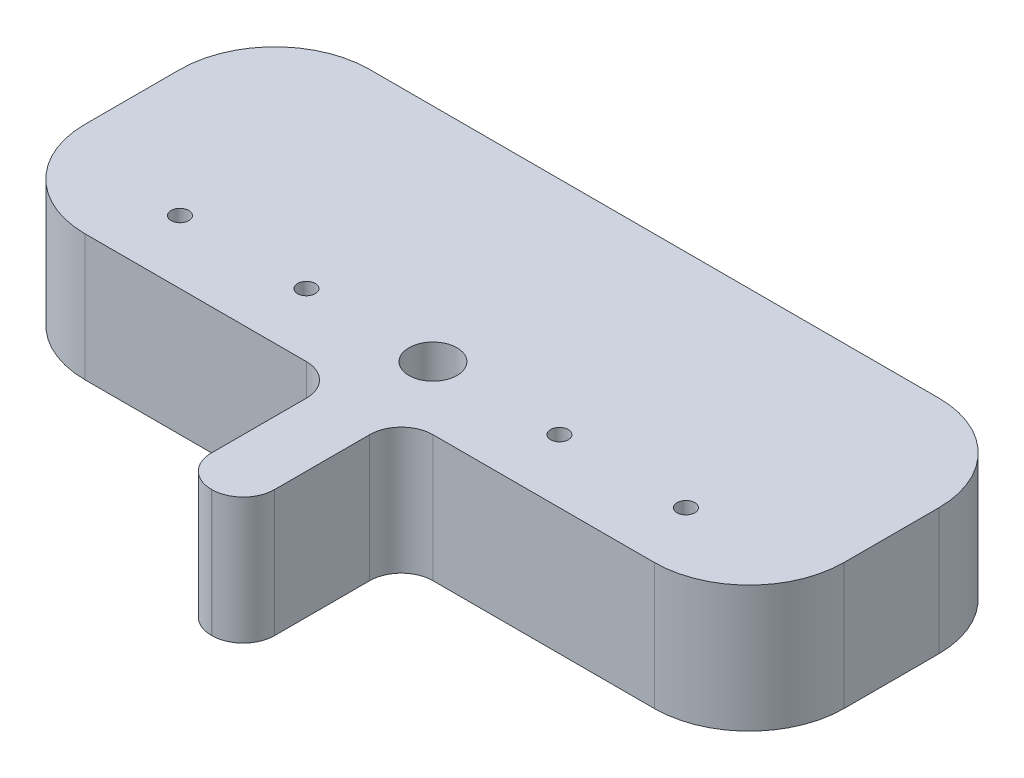
ISO-10303-21;
HEADER;
FILE_DESCRIPTION(('STEP AP214'),'2;1');
FILE_NAME('part.step','',(''),(''),'','','');
FILE_SCHEMA(('AUTOMOTIVE_DESIGN { 1 0 10303 214 1 1 1 1 }'));
ENDSEC;
DATA;
#1=APPLICATION_CONTEXT('core data for automotive mechanical design processes');
#2=APPLICATION_PROTOCOL_DEFINITION('international standard','automotive_design',2000,#1);
#3=PRODUCT_CONTEXT('',#1,'mechanical');
#4=PRODUCT('Part','Part','',(#3));
#5=PRODUCT_RELATED_PRODUCT_CATEGORY('part','',(#4));
#6=PRODUCT_DEFINITION_FORMATION('','',#4);
#7=PRODUCT_DEFINITION_CONTEXT('part definition',#1,'design');
#8=PRODUCT_DEFINITION('design','',#6,#7);
#9=PRODUCT_DEFINITION_SHAPE('','',#8);
#10=(LENGTH_UNIT() NAMED_UNIT(*) SI_UNIT(.MILLI.,.METRE.));
#11=(NAMED_UNIT(*) PLANE_ANGLE_UNIT() SI_UNIT($,.RADIAN.));
#12=(NAMED_UNIT(*) SI_UNIT($,.STERADIAN.) SOLID_ANGLE_UNIT());
#13=UNCERTAINTY_MEASURE_WITH_UNIT(LENGTH_MEASURE(1.E-05),#10,'distance_accuracy_value','');
#14=(GEOMETRIC_REPRESENTATION_CONTEXT(3) GLOBAL_UNCERTAINTY_ASSIGNED_CONTEXT((#13)) GLOBAL_UNIT_ASSIGNED_CONTEXT((#10,
#11,#12)) REPRESENTATION_CONTEXT('',''));
#15=CARTESIAN_POINT('',(0.,0.,0.));
#16=DIRECTION('',(0.,0.,1.));
#17=DIRECTION('',(1.,0.,0.));
#18=AXIS2_PLACEMENT_3D('',#15,#16,#17);
#19=CARTESIAN_POINT('',(16.2968222222222,12.7,8.62817777777777));
#20=DIRECTION('',(0.,1.,0.));
#21=DIRECTION('',(0.,0.,1.));
#22=AXIS2_PLACEMENT_3D('',#19,#20,#21);
#23=PLANE('',#22);
#24=CARTESIAN_POINT('',(-9.0777777777778,12.7,-10.4472222222221));
#25=DIRECTION('',(0.,1.,0.));
#26=DIRECTION('',(0.,0.,1.));
#27=AXIS2_PLACEMENT_3D('',#24,#25,#26);
#28=CIRCLE('',#27,0.889000000000002);
#29=CARTESIAN_POINT('',(-9.0777777777778,12.7,-9.55822222222205));
#30=VERTEX_POINT('',#29);
#31=EDGE_CURVE('E347',#30,#30,#28,.T.);
#32=ORIENTED_EDGE('',*,*,#31,.F.);
#33=EDGE_LOOP('',(#32));
#34=FACE_BOUND('',#33,.T.);
#35=CARTESIAN_POINT('',(29.0222222222222,12.7,-10.4472222222222));
#36=DIRECTION('',(0.,1.,0.));
#37=DIRECTION('',(0.,0.,1.));
#38=AXIS2_PLACEMENT_3D('',#35,#36,#37);
#39=CIRCLE('',#38,0.889);
#40=CARTESIAN_POINT('',(29.0222222222222,12.7,-9.55822222222223));
#41=VERTEX_POINT('',#40);
#42=EDGE_CURVE('E359',#41,#41,#39,.T.);
#43=ORIENTED_EDGE('',*,*,#42,.F.);
#44=EDGE_LOOP('',(#43));
#45=FACE_BOUND('',#44,.T.);
#46=CARTESIAN_POINT('',(16.2968222222222,12.7,8.62817777777777));
#47=DIRECTION('',(0.,1.,0.));
#48=DIRECTION('',(0.,0.,1.));
#49=AXIS2_PLACEMENT_3D('',#46,#47,#48);
#50=CIRCLE('',#49,3.1496);
#51=CARTESIAN_POINT('',(13.1472222222222,12.7,8.62817777777775));
#52=VERTEX_POINT('',#51);
#53=CARTESIAN_POINT('',(16.2968222222222,12.7,11.7777777777778));
#54=VERTEX_POINT('',#53);
#55=EDGE_CURVE('E208',#52,#54,#50,.T.);
#56=ORIENTED_EDGE('',*,*,#55,.T.);
#57=DIRECTION('',(1.,0.,0.));
#58=VECTOR('',#57,1.);
#59=CARTESIAN_POINT('',(16.2968222222222,12.7,11.7777777777778));
#60=LINE('',#59,#58);
#61=CARTESIAN_POINT('',(16.3476222222222,12.7,11.7777777777778));
#62=VERTEX_POINT('',#61);
#63=EDGE_CURVE('E116',#54,#62,#60,.T.);
#64=ORIENTED_EDGE('',*,*,#63,.T.);
#65=CARTESIAN_POINT('',(16.3476222222222,12.7,8.62817777777777));
#66=DIRECTION('',(0.,1.,0.));
#67=DIRECTION('',(0.,0.,1.));
#68=AXIS2_PLACEMENT_3D('',#65,#66,#67);
#69=CIRCLE('',#68,3.1496);
#70=CARTESIAN_POINT('',(19.4972222222222,12.7,8.62817777777775));
#71=VERTEX_POINT('',#70);
#72=EDGE_CURVE('E247',#62,#71,#69,.T.);
#73=ORIENTED_EDGE('',*,*,#72,.T.);
#74=DIRECTION('',(0.,0.,-1.));
#75=VECTOR('',#74,1.);
#76=CARTESIAN_POINT('',(19.4972222222222,12.7,-0.922222222222205));
#77=LINE('',#76,#75);
#78=CARTESIAN_POINT('',(19.4972222222222,12.7,-0.922222222222205));
#79=VERTEX_POINT('',#78);
#80=EDGE_CURVE('E266',#71,#79,#77,.T.);
#81=ORIENTED_EDGE('',*,*,#80,.T.);
#82=CARTESIAN_POINT('',(22.6722222222222,12.7,-0.922222222222228));
#83=DIRECTION('',(0.,-1.,0.));
#84=DIRECTION('',(0.,0.,-1.));
#85=AXIS2_PLACEMENT_3D('',#82,#83,#84);
#86=CIRCLE('',#85,3.175);
#87=CARTESIAN_POINT('',(22.6722222222222,12.7,-4.09722222222223));
#88=VERTEX_POINT('',#87);
#89=EDGE_CURVE('E263',#79,#88,#86,.T.);
#90=ORIENTED_EDGE('',*,*,#89,.T.);
#91=DIRECTION('',(1.,0.,0.));
#92=VECTOR('',#91,1.);
#93=CARTESIAN_POINT('',(22.6722222222222,12.7,-4.09722222222223));
#94=LINE('',#93,#92);
#95=CARTESIAN_POINT('',(44.8972222222221,12.7,-4.09722222222223));
#96=VERTEX_POINT('',#95);
#97=EDGE_CURVE('E265',#88,#96,#94,.T.);
#98=ORIENTED_EDGE('',*,*,#97,.T.);
#99=CARTESIAN_POINT('',(44.8972222222222,12.7,-13.6222222222222));
#100=DIRECTION('',(0.,1.,0.));
#101=DIRECTION('',(0.,0.,1.));
#102=AXIS2_PLACEMENT_3D('',#99,#100,#101);
#103=CIRCLE('',#102,9.525);
#104=CARTESIAN_POINT('',(54.4222222222222,12.7,-13.6222222222223));
#105=VERTEX_POINT('',#104);
#106=EDGE_CURVE('E268',#96,#105,#103,.T.);
#107=ORIENTED_EDGE('',*,*,#106,.T.);
#108=DIRECTION('',(0.,0.,-1.));
#109=VECTOR('',#108,1.);
#110=CARTESIAN_POINT('',(54.4222222222222,12.7,-23.1472222222222));
#111=LINE('',#110,#109);
#112=CARTESIAN_POINT('',(54.4222222222222,12.7,-23.1472222222222));
#113=VERTEX_POINT('',#112);
#114=EDGE_CURVE('E274',#105,#113,#111,.T.);
#115=ORIENTED_EDGE('',*,*,#114,.T.);
#116=CARTESIAN_POINT('',(44.8972222222222,12.7,-23.1472222222222));
#117=DIRECTION('',(0.,1.,0.));
#118=DIRECTION('',(0.,0.,-1.));
#119=AXIS2_PLACEMENT_3D('',#116,#117,#118);
#120=CIRCLE('',#119,9.525);
#121=CARTESIAN_POINT('',(44.8972222222221,12.7,-32.6722222222222));
#122=VERTEX_POINT('',#121);
#123=EDGE_CURVE('E276',#113,#122,#120,.T.);
#124=ORIENTED_EDGE('',*,*,#123,.T.);
#125=DIRECTION('',(-1.,0.,0.));
#126=VECTOR('',#125,1.);
#127=CARTESIAN_POINT('',(-12.2527777777777,12.7,-32.6722222222222));
#128=LINE('',#127,#126);
#129=CARTESIAN_POINT('',(-12.2527777777777,12.7,-32.6722222222222));
#130=VERTEX_POINT('',#129);
#131=EDGE_CURVE('E278',#122,#130,#128,.T.);
#132=ORIENTED_EDGE('',*,*,#131,.T.);
#133=CARTESIAN_POINT('',(-12.2527777777778,12.7,-23.1472222222222));
#134=DIRECTION('',(0.,1.,0.));
#135=DIRECTION('',(0.,0.,1.));
#136=AXIS2_PLACEMENT_3D('',#133,#134,#135);
#137=CIRCLE('',#136,9.525);
#138=CARTESIAN_POINT('',(-21.7777777777778,12.7,-23.1472222222222));
#139=VERTEX_POINT('',#138);
#140=EDGE_CURVE('E280',#130,#139,#137,.T.);
#141=ORIENTED_EDGE('',*,*,#140,.T.);
#142=DIRECTION('',(0.,0.,1.));
#143=VECTOR('',#142,1.);
#144=CARTESIAN_POINT('',(-21.7777777777778,12.7,-23.1472222222222));
#145=LINE('',#144,#143);
#146=CARTESIAN_POINT('',(-21.7777777777778,12.7,-13.6222222222223));
#147=VERTEX_POINT('',#146);
#148=EDGE_CURVE('E282',#139,#147,#145,.T.);
#149=ORIENTED_EDGE('',*,*,#148,.T.);
#150=CARTESIAN_POINT('',(-12.2527777777778,12.7,-13.6222222222222));
#151=DIRECTION('',(0.,1.,0.));
#152=DIRECTION('',(0.,0.,-1.));
#153=AXIS2_PLACEMENT_3D('',#150,#151,#152);
#154=CIRCLE('',#153,9.525);
#155=CARTESIAN_POINT('',(-12.2527777777777,12.7,-4.09722222222223));
#156=VERTEX_POINT('',#155);
#157=EDGE_CURVE('E159',#147,#156,#154,.T.);
#158=ORIENTED_EDGE('',*,*,#157,.T.);
#159=DIRECTION('',(1.,0.,0.));
#160=VECTOR('',#159,1.);
#161=CARTESIAN_POINT('',(-12.2527777777777,12.7,-4.09722222222223));
#162=LINE('',#161,#160);
#163=CARTESIAN_POINT('',(9.97222222222218,12.7,-4.09722222222223));
#164=VERTEX_POINT('',#163);
#165=EDGE_CURVE('E153',#156,#164,#162,.T.);
#166=ORIENTED_EDGE('',*,*,#165,.T.);
#167=CARTESIAN_POINT('',(9.9722222222222,12.7,-0.922222222222228));
#168=DIRECTION('',(0.,-1.,0.));
#169=DIRECTION('',(0.,0.,-1.));
#170=AXIS2_PLACEMENT_3D('',#167,#168,#169);
#171=CIRCLE('',#170,3.175);
#172=CARTESIAN_POINT('',(13.1472222222222,12.7,-0.922222222222206));
#173=VERTEX_POINT('',#172);
#174=EDGE_CURVE('E157',#164,#173,#171,.T.);
#175=ORIENTED_EDGE('',*,*,#174,.T.);
#176=DIRECTION('',(0.,0.,1.));
#177=VECTOR('',#176,1.);
#178=CARTESIAN_POINT('',(13.1472222222222,12.7,-0.922222222222206));
#179=LINE('',#178,#177);
#180=EDGE_CURVE('E49',#173,#52,#179,.T.);
#181=ORIENTED_EDGE('',*,*,#180,.T.);
#182=EDGE_LOOP('',(#56,#64,#73,#81,#90,#98,#107,#115,#124,#132,#141,#149,#158,#166,#175,#181));
#183=FACE_BOUND('',#182,.T.);
#184=CARTESIAN_POINT('',(16.3222222222222,12.7,-10.4472222222222));
#185=DIRECTION('',(0.,1.,0.));
#186=DIRECTION('',(0.,0.,1.));
#187=AXIS2_PLACEMENT_3D('',#184,#185,#186);
#188=CIRCLE('',#187,2.413);
#189=CARTESIAN_POINT('',(16.3222222222222,12.7,-8.03422222222224));
#190=VERTEX_POINT('',#189);
#191=EDGE_CURVE('E181',#190,#190,#188,.T.);
#192=ORIENTED_EDGE('',*,*,#191,.F.);
#193=EDGE_LOOP('',(#192));
#194=FACE_BOUND('',#193,.T.);
#195=CARTESIAN_POINT('',(3.6222222222222,12.7,-10.4472222222221));
#196=DIRECTION('',(0.,1.,0.));
#197=DIRECTION('',(0.,0.,1.));
#198=AXIS2_PLACEMENT_3D('',#195,#196,#197);
#199=CIRCLE('',#198,0.889);
#200=CARTESIAN_POINT('',(3.6222222222222,12.7,-9.55822222222215));
#201=VERTEX_POINT('',#200);
#202=EDGE_CURVE('E353',#201,#201,#199,.T.);
#203=ORIENTED_EDGE('',*,*,#202,.F.);
#204=EDGE_LOOP('',(#203));
#205=FACE_BOUND('',#204,.T.);
#206=CARTESIAN_POINT('',(41.7222222222222,12.7,-10.4472222222222));
#207=DIRECTION('',(0.,1.,0.));
#208=DIRECTION('',(0.,0.,1.));
#209=AXIS2_PLACEMENT_3D('',#206,#207,#208);
#210=CIRCLE('',#209,0.889000000000003);
#211=CARTESIAN_POINT('',(41.7222222222222,12.7,-9.55822222222223));
#212=VERTEX_POINT('',#211);
#213=EDGE_CURVE('E338',#212,#212,#210,.T.);
#214=ORIENTED_EDGE('',*,*,#213,.F.);
#215=EDGE_LOOP('',(#214));
#216=FACE_BOUND('',#215,.T.);
#217=ADVANCED_FACE('F32',(#34,#45,#183,#194,#205,#216),#23,.T.);
#218=CARTESIAN_POINT('',(16.2968222222222,0.,8.62817777777777));
#219=DIRECTION('',(0.,1.,0.));
#220=DIRECTION('',(0.,0.,1.));
#221=AXIS2_PLACEMENT_3D('',#218,#219,#220);
#222=PLANE('',#221);
#223=CARTESIAN_POINT('',(-9.0777777777778,0.,-10.4472222222221));
#224=DIRECTION('',(0.,1.,0.));
#225=DIRECTION('',(0.,0.,1.));
#226=AXIS2_PLACEMENT_3D('',#223,#224,#225);
#227=CIRCLE('',#226,0.889000000000002);
#228=CARTESIAN_POINT('',(-9.0777777777778,0.,-9.55822222222205));
#229=VERTEX_POINT('',#228);
#230=EDGE_CURVE('E344',#229,#229,#227,.T.);
#231=ORIENTED_EDGE('',*,*,#230,.T.);
#232=EDGE_LOOP('',(#231));
#233=FACE_BOUND('',#232,.T.);
#234=CARTESIAN_POINT('',(29.0222222222222,0.,-10.4472222222222));
#235=DIRECTION('',(0.,1.,0.));
#236=DIRECTION('',(0.,0.,1.));
#237=AXIS2_PLACEMENT_3D('',#234,#235,#236);
#238=CIRCLE('',#237,0.889);
#239=CARTESIAN_POINT('',(29.0222222222222,0.,-9.55822222222223));
#240=VERTEX_POINT('',#239);
#241=EDGE_CURVE('E356',#240,#240,#238,.T.);
#242=ORIENTED_EDGE('',*,*,#241,.T.);
#243=EDGE_LOOP('',(#242));
#244=FACE_BOUND('',#243,.T.);
#245=CARTESIAN_POINT('',(16.2968222222222,0.,8.62817777777777));
#246=DIRECTION('',(0.,1.,0.));
#247=DIRECTION('',(0.,0.,1.));
#248=AXIS2_PLACEMENT_3D('',#245,#246,#247);
#249=CIRCLE('',#248,3.1496);
#250=CARTESIAN_POINT('',(13.1472222222222,0.,8.62817777777775));
#251=VERTEX_POINT('',#250);
#252=CARTESIAN_POINT('',(16.2968222222222,0.,11.7777777777778));
#253=VERTEX_POINT('',#252);
#254=EDGE_CURVE('E177',#251,#253,#249,.T.);
#255=ORIENTED_EDGE('',*,*,#254,.F.);
#256=DIRECTION('',(0.,0.,1.));
#257=VECTOR('',#256,1.);
#258=CARTESIAN_POINT('',(13.1472222222222,0.,-0.922222222222206));
#259=LINE('',#258,#257);
#260=CARTESIAN_POINT('',(13.1472222222222,0.,-0.922222222222206));
#261=VERTEX_POINT('',#260);
#262=EDGE_CURVE('E108',#261,#251,#259,.T.);
#263=ORIENTED_EDGE('',*,*,#262,.F.);
#264=CARTESIAN_POINT('',(9.9722222222222,0.,-0.922222222222228));
#265=DIRECTION('',(0.,-1.,0.));
#266=DIRECTION('',(0.,0.,-1.));
#267=AXIS2_PLACEMENT_3D('',#264,#265,#266);
#268=CIRCLE('',#267,3.175);
#269=CARTESIAN_POINT('',(9.97222222222218,0.,-4.09722222222223));
#270=VERTEX_POINT('',#269);
#271=EDGE_CURVE('E102',#270,#261,#268,.T.);
#272=ORIENTED_EDGE('',*,*,#271,.F.);
#273=DIRECTION('',(1.,0.,0.));
#274=VECTOR('',#273,1.);
#275=CARTESIAN_POINT('',(-12.2527777777777,0.,-4.09722222222223));
#276=LINE('',#275,#274);
#277=CARTESIAN_POINT('',(-12.2527777777777,0.,-4.09722222222223));
#278=VERTEX_POINT('',#277);
#279=EDGE_CURVE('E167',#278,#270,#276,.T.);
#280=ORIENTED_EDGE('',*,*,#279,.F.);
#281=CARTESIAN_POINT('',(-12.2527777777778,0.,-13.6222222222222));
#282=DIRECTION('',(0.,1.,0.));
#283=DIRECTION('',(0.,0.,-1.));
#284=AXIS2_PLACEMENT_3D('',#281,#282,#283);
#285=CIRCLE('',#284,9.525);
#286=CARTESIAN_POINT('',(-21.7777777777778,0.,-13.6222222222223));
#287=VERTEX_POINT('',#286);
#288=EDGE_CURVE('E203',#287,#278,#285,.T.);
#289=ORIENTED_EDGE('',*,*,#288,.F.);
#290=DIRECTION('',(0.,0.,1.));
#291=VECTOR('',#290,1.);
#292=CARTESIAN_POINT('',(-21.7777777777778,0.,-23.1472222222222));
#293=LINE('',#292,#291);
#294=CARTESIAN_POINT('',(-21.7777777777778,0.,-23.1472222222222));
#295=VERTEX_POINT('',#294);
#296=EDGE_CURVE('E201',#295,#287,#293,.T.);
#297=ORIENTED_EDGE('',*,*,#296,.F.);
#298=CARTESIAN_POINT('',(-12.2527777777778,0.,-23.1472222222222));
#299=DIRECTION('',(0.,1.,0.));
#300=DIRECTION('',(0.,0.,1.));
#301=AXIS2_PLACEMENT_3D('',#298,#299,#300);
#302=CIRCLE('',#301,9.525);
#303=CARTESIAN_POINT('',(-12.2527777777777,0.,-32.6722222222222));
#304=VERTEX_POINT('',#303);
#305=EDGE_CURVE('E199',#304,#295,#302,.T.);
#306=ORIENTED_EDGE('',*,*,#305,.F.);
#307=DIRECTION('',(-1.,0.,0.));
#308=VECTOR('',#307,1.);
#309=CARTESIAN_POINT('',(-12.2527777777777,0.,-32.6722222222222));
#310=LINE('',#309,#308);
#311=CARTESIAN_POINT('',(44.8972222222221,0.,-32.6722222222222));
#312=VERTEX_POINT('',#311);
#313=EDGE_CURVE('E197',#312,#304,#310,.T.);
#314=ORIENTED_EDGE('',*,*,#313,.F.);
#315=CARTESIAN_POINT('',(44.8972222222222,0.,-23.1472222222222));
#316=DIRECTION('',(0.,1.,0.));
#317=DIRECTION('',(0.,0.,-1.));
#318=AXIS2_PLACEMENT_3D('',#315,#316,#317);
#319=CIRCLE('',#318,9.525);
#320=CARTESIAN_POINT('',(54.4222222222222,0.,-23.1472222222222));
#321=VERTEX_POINT('',#320);
#322=EDGE_CURVE('E195',#321,#312,#319,.T.);
#323=ORIENTED_EDGE('',*,*,#322,.F.);
#324=DIRECTION('',(0.,0.,-1.));
#325=VECTOR('',#324,1.);
#326=CARTESIAN_POINT('',(54.4222222222222,0.,-23.1472222222222));
#327=LINE('',#326,#325);
#328=CARTESIAN_POINT('',(54.4222222222222,0.,-13.6222222222223));
#329=VERTEX_POINT('',#328);
#330=EDGE_CURVE('E193',#329,#321,#327,.T.);
#331=ORIENTED_EDGE('',*,*,#330,.F.);
#332=CARTESIAN_POINT('',(44.8972222222222,0.,-13.6222222222222));
#333=DIRECTION('',(0.,1.,0.));
#334=DIRECTION('',(0.,0.,1.));
#335=AXIS2_PLACEMENT_3D('',#332,#333,#334);
#336=CIRCLE('',#335,9.525);
#337=CARTESIAN_POINT('',(44.8972222222221,0.,-4.09722222222223));
#338=VERTEX_POINT('',#337);
#339=EDGE_CURVE('E191',#338,#329,#336,.T.);
#340=ORIENTED_EDGE('',*,*,#339,.F.);
#341=DIRECTION('',(1.,0.,0.));
#342=VECTOR('',#341,1.);
#343=CARTESIAN_POINT('',(22.6722222222222,0.,-4.09722222222223));
#344=LINE('',#343,#342);
#345=CARTESIAN_POINT('',(22.6722222222222,0.,-4.09722222222223));
#346=VERTEX_POINT('',#345);
#347=EDGE_CURVE('E189',#346,#338,#344,.T.);
#348=ORIENTED_EDGE('',*,*,#347,.F.);
#349=CARTESIAN_POINT('',(22.6722222222222,0.,-0.922222222222228));
#350=DIRECTION('',(0.,-1.,0.));
#351=DIRECTION('',(0.,0.,-1.));
#352=AXIS2_PLACEMENT_3D('',#349,#350,#351);
#353=CIRCLE('',#352,3.175);
#354=CARTESIAN_POINT('',(19.4972222222222,0.,-0.922222222222205));
#355=VERTEX_POINT('',#354);
#356=EDGE_CURVE('E187',#355,#346,#353,.T.);
#357=ORIENTED_EDGE('',*,*,#356,.F.);
#358=DIRECTION('',(0.,0.,-1.));
#359=VECTOR('',#358,1.);
#360=CARTESIAN_POINT('',(19.4972222222222,0.,-0.922222222222205));
#361=LINE('',#360,#359);
#362=CARTESIAN_POINT('',(19.4972222222222,0.,8.62817777777775));
#363=VERTEX_POINT('',#362);
#364=EDGE_CURVE('E185',#363,#355,#361,.T.);
#365=ORIENTED_EDGE('',*,*,#364,.F.);
#366=CARTESIAN_POINT('',(16.3476222222222,0.,8.62817777777777));
#367=DIRECTION('',(0.,1.,0.));
#368=DIRECTION('',(0.,0.,1.));
#369=AXIS2_PLACEMENT_3D('',#366,#367,#368);
#370=CIRCLE('',#369,3.1496);
#371=CARTESIAN_POINT('',(16.3476222222222,0.,11.7777777777778));
#372=VERTEX_POINT('',#371);
#373=EDGE_CURVE('E183',#372,#363,#370,.T.);
#374=ORIENTED_EDGE('',*,*,#373,.F.);
#375=DIRECTION('',(1.,0.,0.));
#376=VECTOR('',#375,1.);
#377=CARTESIAN_POINT('',(16.2968222222222,0.,11.7777777777778));
#378=LINE('',#377,#376);
#379=EDGE_CURVE('E180',#253,#372,#378,.T.);
#380=ORIENTED_EDGE('',*,*,#379,.F.);
#381=EDGE_LOOP('',(#255,#263,#272,#280,#289,#297,#306,#314,#323,#331,#340,#348,#357,#365,#374,#380));
#382=FACE_BOUND('',#381,.T.);
#383=CARTESIAN_POINT('',(16.3222222222222,0.,-10.4472222222222));
#384=DIRECTION('',(0.,1.,0.));
#385=DIRECTION('',(0.,0.,1.));
#386=AXIS2_PLACEMENT_3D('',#383,#384,#385);
#387=CIRCLE('',#386,2.413);
#388=CARTESIAN_POINT('',(16.3222222222222,0.,-8.03422222222224));
#389=VERTEX_POINT('',#388);
#390=EDGE_CURVE('E362',#389,#389,#387,.T.);
#391=ORIENTED_EDGE('',*,*,#390,.T.);
#392=EDGE_LOOP('',(#391));
#393=FACE_BOUND('',#392,.T.);
#394=CARTESIAN_POINT('',(3.6222222222222,0.,-10.4472222222221));
#395=DIRECTION('',(0.,1.,0.));
#396=DIRECTION('',(0.,0.,1.));
#397=AXIS2_PLACEMENT_3D('',#394,#395,#396);
#398=CIRCLE('',#397,0.889);
#399=CARTESIAN_POINT('',(3.6222222222222,0.,-9.55822222222215));
#400=VERTEX_POINT('',#399);
#401=EDGE_CURVE('E350',#400,#400,#398,.T.);
#402=ORIENTED_EDGE('',*,*,#401,.T.);
#403=EDGE_LOOP('',(#402));
#404=FACE_BOUND('',#403,.T.);
#405=CARTESIAN_POINT('',(41.7222222222222,0.,-10.4472222222222));
#406=DIRECTION('',(0.,1.,0.));
#407=DIRECTION('',(0.,0.,1.));
#408=AXIS2_PLACEMENT_3D('',#405,#406,#407);
#409=CIRCLE('',#408,0.889000000000003);
#410=CARTESIAN_POINT('',(41.7222222222222,0.,-9.55822222222223));
#411=VERTEX_POINT('',#410);
#412=EDGE_CURVE('E341',#411,#411,#409,.T.);
#413=ORIENTED_EDGE('',*,*,#412,.T.);
#414=EDGE_LOOP('',(#413));
#415=FACE_BOUND('',#414,.T.);
#416=ADVANCED_FACE('F251',(#233,#244,#382,#393,#404,#415),#222,.F.);
#417=CARTESIAN_POINT('',(16.2968222222222,12.7,8.62817777777777));
#418=DIRECTION('',(0.,-1.,0.));
#419=DIRECTION('',(0.,0.,-1.));
#420=AXIS2_PLACEMENT_3D('',#417,#418,#419);
#421=CYLINDRICAL_SURFACE('',#420,3.1496);
#422=ORIENTED_EDGE('',*,*,#254,.T.);
#423=DIRECTION('',(0.,-1.,0.));
#424=VECTOR('',#423,1.);
#425=CARTESIAN_POINT('',(16.2968222222222,12.7,11.7777777777778));
#426=LINE('',#425,#424);
#427=EDGE_CURVE('E11',#54,#253,#426,.T.);
#428=ORIENTED_EDGE('',*,*,#427,.F.);
#429=ORIENTED_EDGE('',*,*,#55,.F.);
#430=DIRECTION('',(0.,-1.,0.));
#431=VECTOR('',#430,1.);
#432=CARTESIAN_POINT('',(13.1472222222222,12.7,8.62817777777775));
#433=LINE('',#432,#431);
#434=EDGE_CURVE('E173',#52,#251,#433,.T.);
#435=ORIENTED_EDGE('',*,*,#434,.T.);
#436=EDGE_LOOP('',(#422,#428,#429,#435));
#437=FACE_BOUND('',#436,.T.);
#438=ADVANCED_FACE('F34',(#437),#421,.T.);
#439=CARTESIAN_POINT('',(16.2968222222222,12.7,11.7777777777778));
#440=DIRECTION('',(0.,0.,-1.));
#441=DIRECTION('',(-1.,0.,0.));
#442=AXIS2_PLACEMENT_3D('',#439,#440,#441);
#443=PLANE('',#442);
#444=ORIENTED_EDGE('',*,*,#379,.T.);
#445=DIRECTION('',(0.,-1.,0.));
#446=VECTOR('',#445,1.);
#447=CARTESIAN_POINT('',(16.3476222222222,12.7,11.7777777777778));
#448=LINE('',#447,#446);
#449=EDGE_CURVE('E41',#62,#372,#448,.T.);
#450=ORIENTED_EDGE('',*,*,#449,.F.);
#451=ORIENTED_EDGE('',*,*,#63,.F.);
#452=ORIENTED_EDGE('',*,*,#427,.T.);
#453=EDGE_LOOP('',(#444,#450,#451,#452));
#454=FACE_BOUND('',#453,.T.);
#455=ADVANCED_FACE('F520',(#454),#443,.F.);
#456=CARTESIAN_POINT('',(16.3476222222222,12.7,8.62817777777777));
#457=DIRECTION('',(0.,-1.,0.));
#458=DIRECTION('',(0.,0.,-1.));
#459=AXIS2_PLACEMENT_3D('',#456,#457,#458);
#460=CYLINDRICAL_SURFACE('',#459,3.1496);
#461=ORIENTED_EDGE('',*,*,#373,.T.);
#462=DIRECTION('',(0.,-1.,0.));
#463=VECTOR('',#462,1.);
#464=CARTESIAN_POINT('',(19.4972222222222,12.7,8.62817777777775));
#465=LINE('',#464,#463);
#466=EDGE_CURVE('E239',#71,#363,#465,.T.);
#467=ORIENTED_EDGE('',*,*,#466,.F.);
#468=ORIENTED_EDGE('',*,*,#72,.F.);
#469=ORIENTED_EDGE('',*,*,#449,.T.);
#470=EDGE_LOOP('',(#461,#467,#468,#469));
#471=FACE_BOUND('',#470,.T.);
#472=ADVANCED_FACE('F245',(#471),#460,.T.);
#473=CARTESIAN_POINT('',(19.4972222222222,12.7,-0.922222222222205));
#474=DIRECTION('',(-1.,0.,0.));
#475=DIRECTION('',(0.,0.,1.));
#476=AXIS2_PLACEMENT_3D('',#473,#474,#475);
#477=PLANE('',#476);
#478=ORIENTED_EDGE('',*,*,#364,.T.);
#479=DIRECTION('',(0.,-1.,0.));
#480=VECTOR('',#479,1.);
#481=CARTESIAN_POINT('',(19.4972222222222,12.7,-0.922222222222205));
#482=LINE('',#481,#480);
#483=EDGE_CURVE('E236',#79,#355,#482,.T.);
#484=ORIENTED_EDGE('',*,*,#483,.F.);
#485=ORIENTED_EDGE('',*,*,#80,.F.);
#486=ORIENTED_EDGE('',*,*,#466,.T.);
#487=EDGE_LOOP('',(#478,#484,#485,#486));
#488=FACE_BOUND('',#487,.T.);
#489=ADVANCED_FACE('F257',(#488),#477,.F.);
#490=CARTESIAN_POINT('',(22.6722222222222,12.7,-0.922222222222228));
#491=DIRECTION('',(0.,-1.,0.));
#492=DIRECTION('',(0.,0.,-1.));
#493=AXIS2_PLACEMENT_3D('',#490,#491,#492);
#494=CYLINDRICAL_SURFACE('',#493,3.175);
#495=ORIENTED_EDGE('',*,*,#356,.T.);
#496=DIRECTION('',(0.,-1.,0.));
#497=VECTOR('',#496,1.);
#498=CARTESIAN_POINT('',(22.6722222222222,12.7,-4.09722222222223));
#499=LINE('',#498,#497);
#500=EDGE_CURVE('E233',#88,#346,#499,.T.);
#501=ORIENTED_EDGE('',*,*,#500,.F.);
#502=ORIENTED_EDGE('',*,*,#89,.F.);
#503=ORIENTED_EDGE('',*,*,#483,.T.);
#504=EDGE_LOOP('',(#495,#501,#502,#503));
#505=FACE_BOUND('',#504,.T.);
#506=ADVANCED_FACE('F261',(#505),#494,.F.);
#507=CARTESIAN_POINT('',(22.6722222222222,12.7,-4.09722222222223));
#508=DIRECTION('',(0.,0.,-1.));
#509=DIRECTION('',(-1.,0.,0.));
#510=AXIS2_PLACEMENT_3D('',#507,#508,#509);
#511=PLANE('',#510);
#512=ORIENTED_EDGE('',*,*,#347,.T.);
#513=DIRECTION('',(0.,-1.,0.));
#514=VECTOR('',#513,1.);
#515=CARTESIAN_POINT('',(44.8972222222221,12.7,-4.09722222222223));
#516=LINE('',#515,#514);
#517=EDGE_CURVE('E230',#96,#338,#516,.T.);
#518=ORIENTED_EDGE('',*,*,#517,.F.);
#519=ORIENTED_EDGE('',*,*,#97,.F.);
#520=ORIENTED_EDGE('',*,*,#500,.T.);
#521=EDGE_LOOP('',(#512,#518,#519,#520));
#522=FACE_BOUND('',#521,.T.);
#523=ADVANCED_FACE('F485',(#522),#511,.F.);
#524=CARTESIAN_POINT('',(44.8972222222222,12.7,-13.6222222222222));
#525=DIRECTION('',(0.,-1.,0.));
#526=DIRECTION('',(0.,0.,-1.));
#527=AXIS2_PLACEMENT_3D('',#524,#525,#526);
#528=CYLINDRICAL_SURFACE('',#527,9.525);
#529=ORIENTED_EDGE('',*,*,#339,.T.);
#530=DIRECTION('',(0.,-1.,0.));
#531=VECTOR('',#530,1.);
#532=CARTESIAN_POINT('',(54.4222222222222,12.7,-13.6222222222223));
#533=LINE('',#532,#531);
#534=EDGE_CURVE('E227',#105,#329,#533,.T.);
#535=ORIENTED_EDGE('',*,*,#534,.F.);
#536=ORIENTED_EDGE('',*,*,#106,.F.);
#537=ORIENTED_EDGE('',*,*,#517,.T.);
#538=EDGE_LOOP('',(#529,#535,#536,#537));
#539=FACE_BOUND('',#538,.T.);
#540=ADVANCED_FACE('F475',(#539),#528,.T.);
#541=CARTESIAN_POINT('',(54.4222222222222,12.7,-23.1472222222222));
#542=DIRECTION('',(-1.,0.,0.));
#543=DIRECTION('',(0.,0.,1.));
#544=AXIS2_PLACEMENT_3D('',#541,#542,#543);
#545=PLANE('',#544);
#546=ORIENTED_EDGE('',*,*,#330,.T.);
#547=DIRECTION('',(0.,-1.,0.));
#548=VECTOR('',#547,1.);
#549=CARTESIAN_POINT('',(54.4222222222222,12.7,-23.1472222222222));
#550=LINE('',#549,#548);
#551=EDGE_CURVE('E224',#113,#321,#550,.T.);
#552=ORIENTED_EDGE('',*,*,#551,.F.);
#553=ORIENTED_EDGE('',*,*,#114,.F.);
#554=ORIENTED_EDGE('',*,*,#534,.T.);
#555=EDGE_LOOP('',(#546,#552,#553,#554));
#556=FACE_BOUND('',#555,.T.);
#557=ADVANCED_FACE('F465',(#556),#545,.F.);
#558=CARTESIAN_POINT('',(44.8972222222222,12.7,-23.1472222222222));
#559=DIRECTION('',(0.,-1.,0.));
#560=DIRECTION('',(0.,0.,-1.));
#561=AXIS2_PLACEMENT_3D('',#558,#559,#560);
#562=CYLINDRICAL_SURFACE('',#561,9.525);
#563=ORIENTED_EDGE('',*,*,#322,.T.);
#564=DIRECTION('',(0.,-1.,0.));
#565=VECTOR('',#564,1.);
#566=CARTESIAN_POINT('',(44.8972222222221,12.7,-32.6722222222222));
#567=LINE('',#566,#565);
#568=EDGE_CURVE('E221',#122,#312,#567,.T.);
#569=ORIENTED_EDGE('',*,*,#568,.F.);
#570=ORIENTED_EDGE('',*,*,#123,.F.);
#571=ORIENTED_EDGE('',*,*,#551,.T.);
#572=EDGE_LOOP('',(#563,#569,#570,#571));
#573=FACE_BOUND('',#572,.T.);
#574=ADVANCED_FACE('F455',(#573),#562,.T.);
#575=CARTESIAN_POINT('',(-12.2527777777777,12.7,-32.6722222222222));
#576=DIRECTION('',(0.,0.,1.));
#577=DIRECTION('',(1.,0.,0.));
#578=AXIS2_PLACEMENT_3D('',#575,#576,#577);
#579=PLANE('',#578);
#580=ORIENTED_EDGE('',*,*,#313,.T.);
#581=DIRECTION('',(0.,-1.,0.));
#582=VECTOR('',#581,1.);
#583=CARTESIAN_POINT('',(-12.2527777777777,12.7,-32.6722222222222));
#584=LINE('',#583,#582);
#585=EDGE_CURVE('E218',#130,#304,#584,.T.);
#586=ORIENTED_EDGE('',*,*,#585,.F.);
#587=ORIENTED_EDGE('',*,*,#131,.F.);
#588=ORIENTED_EDGE('',*,*,#568,.T.);
#589=EDGE_LOOP('',(#580,#586,#587,#588));
#590=FACE_BOUND('',#589,.T.);
#591=ADVANCED_FACE('F445',(#590),#579,.F.);
#592=CARTESIAN_POINT('',(-12.2527777777778,12.7,-23.1472222222222));
#593=DIRECTION('',(0.,-1.,0.));
#594=DIRECTION('',(0.,0.,-1.));
#595=AXIS2_PLACEMENT_3D('',#592,#593,#594);
#596=CYLINDRICAL_SURFACE('',#595,9.525);
#597=ORIENTED_EDGE('',*,*,#305,.T.);
#598=DIRECTION('',(0.,-1.,0.));
#599=VECTOR('',#598,1.);
#600=CARTESIAN_POINT('',(-21.7777777777778,12.7,-23.1472222222222));
#601=LINE('',#600,#599);
#602=EDGE_CURVE('E215',#139,#295,#601,.T.);
#603=ORIENTED_EDGE('',*,*,#602,.F.);
#604=ORIENTED_EDGE('',*,*,#140,.F.);
#605=ORIENTED_EDGE('',*,*,#585,.T.);
#606=EDGE_LOOP('',(#597,#603,#604,#605));
#607=FACE_BOUND('',#606,.T.);
#608=ADVANCED_FACE('F436',(#607),#596,.T.);
#609=CARTESIAN_POINT('',(-21.7777777777778,12.7,-23.1472222222222));
#610=DIRECTION('',(1.,0.,0.));
#611=DIRECTION('',(0.,0.,-1.));
#612=AXIS2_PLACEMENT_3D('',#609,#610,#611);
#613=PLANE('',#612);
#614=ORIENTED_EDGE('',*,*,#296,.T.);
#615=DIRECTION('',(0.,-1.,0.));
#616=VECTOR('',#615,1.);
#617=CARTESIAN_POINT('',(-21.7777777777778,12.7,-13.6222222222223));
#618=LINE('',#617,#616);
#619=EDGE_CURVE('E212',#147,#287,#618,.T.);
#620=ORIENTED_EDGE('',*,*,#619,.F.);
#621=ORIENTED_EDGE('',*,*,#148,.F.);
#622=ORIENTED_EDGE('',*,*,#602,.T.);
#623=EDGE_LOOP('',(#614,#620,#621,#622));
#624=FACE_BOUND('',#623,.T.);
#625=ADVANCED_FACE('F288',(#624),#613,.F.);
#626=CARTESIAN_POINT('',(-12.2527777777778,12.7,-13.6222222222222));
#627=DIRECTION('',(0.,-1.,0.));
#628=DIRECTION('',(0.,0.,-1.));
#629=AXIS2_PLACEMENT_3D('',#626,#627,#628);
#630=CYLINDRICAL_SURFACE('',#629,9.525);
#631=ORIENTED_EDGE('',*,*,#288,.T.);
#632=DIRECTION('',(0.,-1.,0.));
#633=VECTOR('',#632,1.);
#634=CARTESIAN_POINT('',(-12.2527777777777,12.7,-4.09722222222223));
#635=LINE('',#634,#633);
#636=EDGE_CURVE('E168',#156,#278,#635,.T.);
#637=ORIENTED_EDGE('',*,*,#636,.F.);
#638=ORIENTED_EDGE('',*,*,#157,.F.);
#639=ORIENTED_EDGE('',*,*,#619,.T.);
#640=EDGE_LOOP('',(#631,#637,#638,#639));
#641=FACE_BOUND('',#640,.T.);
#642=ADVANCED_FACE('F292',(#641),#630,.T.);
#643=CARTESIAN_POINT('',(-12.2527777777777,12.7,-4.09722222222223));
#644=DIRECTION('',(0.,0.,-1.));
#645=DIRECTION('',(-1.,0.,0.));
#646=AXIS2_PLACEMENT_3D('',#643,#644,#645);
#647=PLANE('',#646);
#648=ORIENTED_EDGE('',*,*,#279,.T.);
#649=DIRECTION('',(0.,-1.,0.));
#650=VECTOR('',#649,1.);
#651=CARTESIAN_POINT('',(9.97222222222218,12.7,-4.09722222222223));
#652=LINE('',#651,#650);
#653=EDGE_CURVE('E164',#164,#270,#652,.T.);
#654=ORIENTED_EDGE('',*,*,#653,.F.);
#655=ORIENTED_EDGE('',*,*,#165,.F.);
#656=ORIENTED_EDGE('',*,*,#636,.T.);
#657=EDGE_LOOP('',(#648,#654,#655,#656));
#658=FACE_BOUND('',#657,.T.);
#659=ADVANCED_FACE('F165',(#658),#647,.F.);
#660=CARTESIAN_POINT('',(9.9722222222222,12.7,-0.922222222222228));
#661=DIRECTION('',(0.,-1.,0.));
#662=DIRECTION('',(0.,0.,-1.));
#663=AXIS2_PLACEMENT_3D('',#660,#661,#662);
#664=CYLINDRICAL_SURFACE('',#663,3.175);
#665=ORIENTED_EDGE('',*,*,#271,.T.);
#666=DIRECTION('',(0.,-1.,0.));
#667=VECTOR('',#666,1.);
#668=CARTESIAN_POINT('',(13.1472222222222,12.7,-0.922222222222206));
#669=LINE('',#668,#667);
#670=EDGE_CURVE('E169',#173,#261,#669,.T.);
#671=ORIENTED_EDGE('',*,*,#670,.F.);
#672=ORIENTED_EDGE('',*,*,#174,.F.);
#673=ORIENTED_EDGE('',*,*,#653,.T.);
#674=EDGE_LOOP('',(#665,#671,#672,#673));
#675=FACE_BOUND('',#674,.T.);
#676=ADVANCED_FACE('F171',(#675),#664,.F.);
#677=CARTESIAN_POINT('',(13.1472222222222,12.7,-0.922222222222206));
#678=DIRECTION('',(1.,0.,0.));
#679=DIRECTION('',(0.,0.,-1.));
#680=AXIS2_PLACEMENT_3D('',#677,#678,#679);
#681=PLANE('',#680);
#682=ORIENTED_EDGE('',*,*,#262,.T.);
#683=ORIENTED_EDGE('',*,*,#434,.F.);
#684=ORIENTED_EDGE('',*,*,#180,.F.);
#685=ORIENTED_EDGE('',*,*,#670,.T.);
#686=EDGE_LOOP('',(#682,#683,#684,#685));
#687=FACE_BOUND('',#686,.T.);
#688=ADVANCED_FACE('F296',(#687),#681,.F.);
#689=CARTESIAN_POINT('',(16.3222222222222,12.7,-10.4472222222222));
#690=DIRECTION('',(0.,-1.,0.));
#691=DIRECTION('',(0.,0.,-1.));
#692=AXIS2_PLACEMENT_3D('',#689,#690,#691);
#693=CYLINDRICAL_SURFACE('',#692,2.413);
#694=ORIENTED_EDGE('',*,*,#191,.T.);
#695=EDGE_LOOP('',(#694));
#696=FACE_BOUND('',#695,.T.);
#697=ORIENTED_EDGE('',*,*,#390,.F.);
#698=EDGE_LOOP('',(#697));
#699=FACE_BOUND('',#698,.T.);
#700=ADVANCED_FACE('F298',(#696,#699),#693,.F.);
#701=CARTESIAN_POINT('',(29.0222222222222,12.7,-10.4472222222222));
#702=DIRECTION('',(0.,-1.,0.));
#703=DIRECTION('',(0.,0.,-1.));
#704=AXIS2_PLACEMENT_3D('',#701,#702,#703);
#705=CYLINDRICAL_SURFACE('',#704,0.889);
#706=ORIENTED_EDGE('',*,*,#42,.T.);
#707=EDGE_LOOP('',(#706));
#708=FACE_BOUND('',#707,.T.);
#709=ORIENTED_EDGE('',*,*,#241,.F.);
#710=EDGE_LOOP('',(#709));
#711=FACE_BOUND('',#710,.T.);
#712=ADVANCED_FACE('F304',(#708,#711),#705,.F.);
#713=CARTESIAN_POINT('',(3.6222222222222,12.7,-10.4472222222221));
#714=DIRECTION('',(0.,-1.,0.));
#715=DIRECTION('',(0.,0.,-1.));
#716=AXIS2_PLACEMENT_3D('',#713,#714,#715);
#717=CYLINDRICAL_SURFACE('',#716,0.889);
#718=ORIENTED_EDGE('',*,*,#202,.T.);
#719=EDGE_LOOP('',(#718));
#720=FACE_BOUND('',#719,.T.);
#721=ORIENTED_EDGE('',*,*,#401,.F.);
#722=EDGE_LOOP('',(#721));
#723=FACE_BOUND('',#722,.T.);
#724=ADVANCED_FACE('F321',(#720,#723),#717,.F.);
#725=CARTESIAN_POINT('',(-9.0777777777778,12.7,-10.4472222222221));
#726=DIRECTION('',(0.,-1.,0.));
#727=DIRECTION('',(0.,0.,-1.));
#728=AXIS2_PLACEMENT_3D('',#725,#726,#727);
#729=CYLINDRICAL_SURFACE('',#728,0.889000000000002);
#730=ORIENTED_EDGE('',*,*,#31,.T.);
#731=EDGE_LOOP('',(#730));
#732=FACE_BOUND('',#731,.T.);
#733=ORIENTED_EDGE('',*,*,#230,.F.);
#734=EDGE_LOOP('',(#733));
#735=FACE_BOUND('',#734,.T.);
#736=ADVANCED_FACE('F325',(#732,#735),#729,.F.);
#737=CARTESIAN_POINT('',(41.7222222222222,12.7,-10.4472222222222));
#738=DIRECTION('',(0.,-1.,0.));
#739=DIRECTION('',(0.,0.,-1.));
#740=AXIS2_PLACEMENT_3D('',#737,#738,#739);
#741=CYLINDRICAL_SURFACE('',#740,0.889000000000003);
#742=ORIENTED_EDGE('',*,*,#213,.T.);
#743=EDGE_LOOP('',(#742));
#744=FACE_BOUND('',#743,.T.);
#745=ORIENTED_EDGE('',*,*,#412,.F.);
#746=EDGE_LOOP('',(#745));
#747=FACE_BOUND('',#746,.T.);
#748=ADVANCED_FACE('F329',(#744,#747),#741,.F.);
#749=CLOSED_SHELL('',(#217,#416,#438,#455,#472,#489,#506,#523,#540,#557,#574,#591,#608,#625,
#642,#659,#676,#688,#700,#712,#724,#736,#748));
#750=MANIFOLD_SOLID_BREP('B2',#749);
#751=ADVANCED_BREP_SHAPE_REPRESENTATION('',(#18,#750),#14);
#752=SHAPE_DEFINITION_REPRESENTATION(#9,#751);
ENDSEC;
END-ISO-10303-21;
